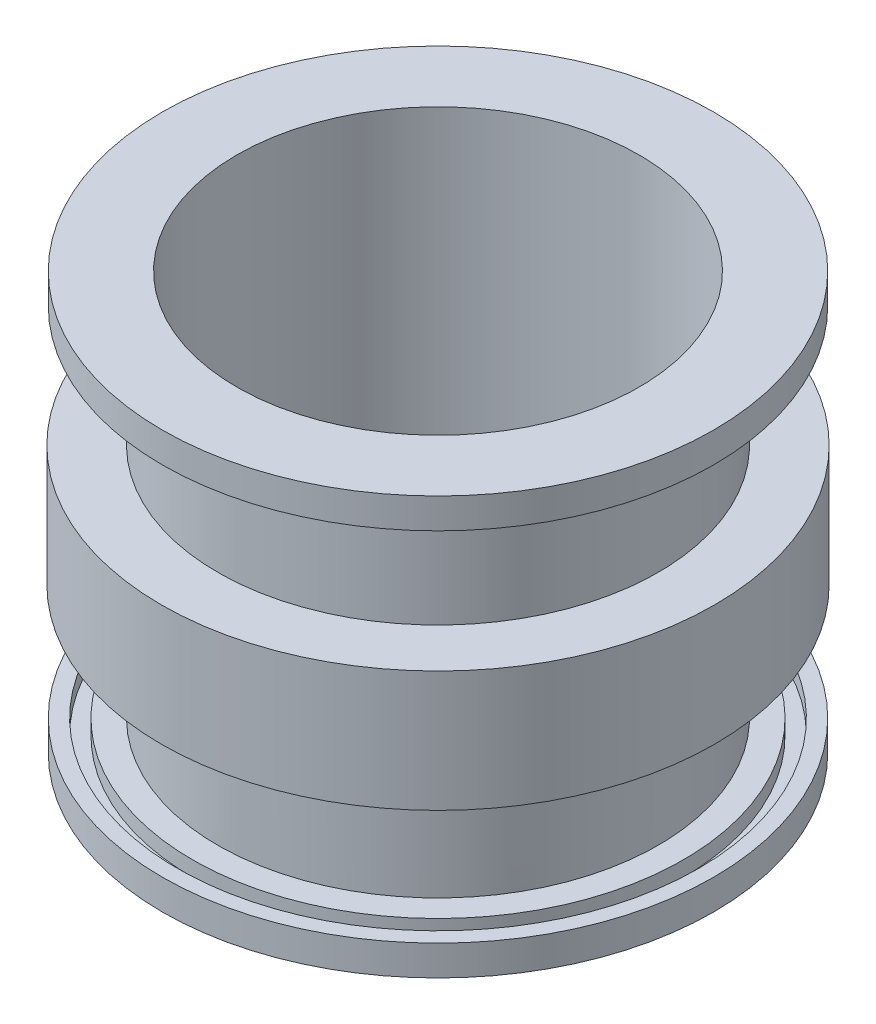
ISO-10303-21;
HEADER;
FILE_DESCRIPTION(('STEP AP214'),'2;1');
FILE_NAME('part.step','',(''),(''),'','','');
FILE_SCHEMA(('AUTOMOTIVE_DESIGN { 1 0 10303 214 1 1 1 1 }'));
ENDSEC;
DATA;
#1=APPLICATION_CONTEXT('core data for automotive mechanical design processes');
#2=APPLICATION_PROTOCOL_DEFINITION('international standard','automotive_design',2000,#1);
#3=PRODUCT_CONTEXT('',#1,'mechanical');
#4=PRODUCT('Part','Part','',(#3));
#5=PRODUCT_RELATED_PRODUCT_CATEGORY('part','',(#4));
#6=PRODUCT_DEFINITION_FORMATION('','',#4);
#7=PRODUCT_DEFINITION_CONTEXT('part definition',#1,'design');
#8=PRODUCT_DEFINITION('design','',#6,#7);
#9=PRODUCT_DEFINITION_SHAPE('','',#8);
#10=(LENGTH_UNIT() NAMED_UNIT(*) SI_UNIT(.MILLI.,.METRE.));
#11=(NAMED_UNIT(*) PLANE_ANGLE_UNIT() SI_UNIT($,.RADIAN.));
#12=(NAMED_UNIT(*) SI_UNIT($,.STERADIAN.) SOLID_ANGLE_UNIT());
#13=UNCERTAINTY_MEASURE_WITH_UNIT(LENGTH_MEASURE(1.E-05),#10,'distance_accuracy_value','');
#14=(GEOMETRIC_REPRESENTATION_CONTEXT(3) GLOBAL_UNCERTAINTY_ASSIGNED_CONTEXT((#13)) GLOBAL_UNIT_ASSIGNED_CONTEXT((#10,
#11,#12)) REPRESENTATION_CONTEXT('',''));
#15=CARTESIAN_POINT('',(0.,0.,0.));
#16=DIRECTION('',(0.,0.,1.));
#17=DIRECTION('',(1.,0.,0.));
#18=AXIS2_PLACEMENT_3D('',#15,#16,#17);
#19=CARTESIAN_POINT('',(0.,0.,0.));
#20=DIRECTION('',(0.,1.,0.));
#21=DIRECTION('',(1.,0.,0.));
#22=AXIS2_PLACEMENT_3D('',#19,#20,#21);
#23=PLANE('',#22);
#24=CARTESIAN_POINT('',(0.,0.,0.));
#25=DIRECTION('',(0.,-1.,0.));
#26=DIRECTION('',(1.,0.,0.));
#27=AXIS2_PLACEMENT_3D('',#24,#25,#26);
#28=CIRCLE('',#27,20.);
#29=CARTESIAN_POINT('',(-20.,0.,0.));
#30=VERTEX_POINT('',#29);
#31=EDGE_CURVE('E121',#30,#30,#28,.T.);
#32=ORIENTED_EDGE('',*,*,#31,.F.);
#33=EDGE_LOOP('',(#32));
#34=FACE_BOUND('',#33,.T.);
#35=CARTESIAN_POINT('',(0.,0.,0.));
#36=DIRECTION('',(0.,1.,0.));
#37=DIRECTION('',(1.,0.,0.));
#38=AXIS2_PLACEMENT_3D('',#35,#36,#37);
#39=CIRCLE('',#38,27.4);
#40=CARTESIAN_POINT('',(-27.4,0.,0.));
#41=VERTEX_POINT('',#40);
#42=EDGE_CURVE('E11',#41,#41,#39,.T.);
#43=ORIENTED_EDGE('',*,*,#42,.F.);
#44=EDGE_LOOP('',(#43));
#45=FACE_BOUND('',#44,.T.);
#46=ADVANCED_FACE('F17',(#34,#45),#23,.F.);
#47=CARTESIAN_POINT('',(0.,-2.075,0.));
#48=DIRECTION('',(0.,1.,0.));
#49=DIRECTION('',(1.,0.,0.));
#50=AXIS2_PLACEMENT_3D('',#47,#48,#49);
#51=CYLINDRICAL_SURFACE('',#50,27.4);
#52=CARTESIAN_POINT('',(0.,3.,0.));
#53=DIRECTION('',(0.,1.,0.));
#54=DIRECTION('',(1.,0.,0.));
#55=AXIS2_PLACEMENT_3D('',#52,#53,#54);
#56=CIRCLE('',#55,27.4);
#57=CARTESIAN_POINT('',(-27.4,3.,0.));
#58=VERTEX_POINT('',#57);
#59=EDGE_CURVE('E160',#58,#58,#56,.T.);
#60=ORIENTED_EDGE('',*,*,#59,.F.);
#61=DIRECTION('',(0.,-1.,0.));
#62=VECTOR('',#61,1.);
#63=CARTESIAN_POINT('',(-27.4,-2.075,0.));
#64=LINE('',#63,#62);
#65=EDGE_CURVE('E28',#58,#41,#64,.T.);
#66=ORIENTED_EDGE('',*,*,#65,.T.);
#67=ORIENTED_EDGE('',*,*,#42,.T.);
#68=ORIENTED_EDGE('',*,*,#65,.F.);
#69=EDGE_LOOP('',(#60,#66,#67,#68));
#70=FACE_BOUND('',#69,.T.);
#71=ADVANCED_FACE('F19',(#70),#51,.T.);
#72=CARTESIAN_POINT('',(0.,3.,0.));
#73=DIRECTION('',(0.,1.,0.));
#74=DIRECTION('',(1.,0.,0.));
#75=AXIS2_PLACEMENT_3D('',#72,#73,#74);
#76=PLANE('',#75);
#77=CARTESIAN_POINT('',(0.,3.,0.));
#78=DIRECTION('',(0.,1.,0.));
#79=DIRECTION('',(1.,0.,0.));
#80=AXIS2_PLACEMENT_3D('',#77,#78,#79);
#81=CIRCLE('',#80,25.9);
#82=CARTESIAN_POINT('',(-25.9,3.,0.));
#83=VERTEX_POINT('',#82);
#84=EDGE_CURVE('E166',#83,#83,#81,.T.);
#85=ORIENTED_EDGE('',*,*,#84,.F.);
#86=EDGE_LOOP('',(#85));
#87=FACE_BOUND('',#86,.T.);
#88=ORIENTED_EDGE('',*,*,#59,.T.);
#89=EDGE_LOOP('',(#88));
#90=FACE_BOUND('',#89,.T.);
#91=ADVANCED_FACE('F231',(#87,#90),#76,.T.);
#92=CARTESIAN_POINT('',(0.,-2.075,0.));
#93=DIRECTION('',(0.,1.,0.));
#94=DIRECTION('',(1.,0.,0.));
#95=AXIS2_PLACEMENT_3D('',#92,#93,#94);
#96=CYLINDRICAL_SURFACE('',#95,25.9);
#97=CARTESIAN_POINT('',(0.,1.5,0.));
#98=DIRECTION('',(0.,1.,0.));
#99=DIRECTION('',(1.,0.,0.));
#100=AXIS2_PLACEMENT_3D('',#97,#98,#99);
#101=CIRCLE('',#100,25.9);
#102=CARTESIAN_POINT('',(-25.9,1.5,0.));
#103=VERTEX_POINT('',#102);
#104=EDGE_CURVE('E142',#103,#103,#101,.T.);
#105=ORIENTED_EDGE('',*,*,#104,.F.);
#106=DIRECTION('',(0.,1.,0.));
#107=VECTOR('',#106,1.);
#108=CARTESIAN_POINT('',(-25.9,-2.075,0.));
#109=LINE('',#108,#107);
#110=EDGE_CURVE('E146',#103,#83,#109,.T.);
#111=ORIENTED_EDGE('',*,*,#110,.T.);
#112=ORIENTED_EDGE('',*,*,#84,.T.);
#113=ORIENTED_EDGE('',*,*,#110,.F.);
#114=EDGE_LOOP('',(#105,#111,#112,#113));
#115=FACE_BOUND('',#114,.T.);
#116=ADVANCED_FACE('F215',(#115),#96,.F.);
#117=CARTESIAN_POINT('',(0.,1.5,0.));
#118=DIRECTION('',(0.,1.,0.));
#119=DIRECTION('',(1.,0.,0.));
#120=AXIS2_PLACEMENT_3D('',#117,#118,#119);
#121=PLANE('',#120);
#122=CARTESIAN_POINT('',(0.,1.5,0.));
#123=DIRECTION('',(0.,1.,0.));
#124=DIRECTION('',(1.,0.,0.));
#125=AXIS2_PLACEMENT_3D('',#122,#123,#124);
#126=CIRCLE('',#125,24.4);
#127=CARTESIAN_POINT('',(-24.4,1.5,0.));
#128=VERTEX_POINT('',#127);
#129=EDGE_CURVE('E147',#128,#128,#126,.T.);
#130=ORIENTED_EDGE('',*,*,#129,.F.);
#131=EDGE_LOOP('',(#130));
#132=FACE_BOUND('',#131,.T.);
#133=ORIENTED_EDGE('',*,*,#104,.T.);
#134=EDGE_LOOP('',(#133));
#135=FACE_BOUND('',#134,.T.);
#136=ADVANCED_FACE('F218',(#132,#135),#121,.T.);
#137=CARTESIAN_POINT('',(0.,-2.075,0.));
#138=DIRECTION('',(0.,1.,0.));
#139=DIRECTION('',(1.,0.,0.));
#140=AXIS2_PLACEMENT_3D('',#137,#138,#139);
#141=CYLINDRICAL_SURFACE('',#140,24.4);
#142=CARTESIAN_POINT('',(0.,3.,0.));
#143=DIRECTION('',(0.,1.,0.));
#144=DIRECTION('',(1.,0.,0.));
#145=AXIS2_PLACEMENT_3D('',#142,#143,#144);
#146=CIRCLE('',#145,24.4);
#147=CARTESIAN_POINT('',(-24.4,3.,0.));
#148=VERTEX_POINT('',#147);
#149=EDGE_CURVE('E200',#148,#148,#146,.T.);
#150=ORIENTED_EDGE('',*,*,#149,.F.);
#151=DIRECTION('',(0.,-1.,0.));
#152=VECTOR('',#151,1.);
#153=CARTESIAN_POINT('',(-24.4,-2.075,0.));
#154=LINE('',#153,#152);
#155=EDGE_CURVE('E21',#148,#128,#154,.T.);
#156=ORIENTED_EDGE('',*,*,#155,.T.);
#157=ORIENTED_EDGE('',*,*,#129,.T.);
#158=ORIENTED_EDGE('',*,*,#155,.F.);
#159=EDGE_LOOP('',(#150,#156,#157,#158));
#160=FACE_BOUND('',#159,.T.);
#161=ADVANCED_FACE('F220',(#160),#141,.T.);
#162=CARTESIAN_POINT('',(0.,3.,0.));
#163=DIRECTION('',(0.,1.,0.));
#164=DIRECTION('',(1.,0.,0.));
#165=AXIS2_PLACEMENT_3D('',#162,#163,#164);
#166=PLANE('',#165);
#167=CARTESIAN_POINT('',(0.,2.999999999999,0.));
#168=DIRECTION('',(0.,1.,0.));
#169=DIRECTION('',(1.,0.,0.));
#170=AXIS2_PLACEMENT_3D('',#167,#168,#169);
#171=CIRCLE('',#170,21.9);
#172=CARTESIAN_POINT('',(-21.9,3.,0.));
#173=VERTEX_POINT('',#172);
#174=EDGE_CURVE('E171',#173,#173,#171,.T.);
#175=ORIENTED_EDGE('',*,*,#174,.F.);
#176=EDGE_LOOP('',(#175));
#177=FACE_BOUND('',#176,.T.);
#178=ORIENTED_EDGE('',*,*,#149,.T.);
#179=EDGE_LOOP('',(#178));
#180=FACE_BOUND('',#179,.T.);
#181=ADVANCED_FACE('F228',(#177,#180),#166,.T.);
#182=CARTESIAN_POINT('',(0.,8.75,0.));
#183=DIRECTION('',(0.,1.,0.));
#184=DIRECTION('',(1.,0.,0.));
#185=AXIS2_PLACEMENT_3D('',#182,#183,#184);
#186=CONICAL_SURFACE('',#185,21.95,0.00869543301179552);
#187=CARTESIAN_POINT('',(0.,14.5,0.));
#188=DIRECTION('',(0.,1.,0.));
#189=DIRECTION('',(1.,0.,0.));
#190=AXIS2_PLACEMENT_3D('',#187,#188,#189);
#191=CIRCLE('',#190,22.);
#192=CARTESIAN_POINT('',(-22.,14.5,0.));
#193=VERTEX_POINT('',#192);
#194=EDGE_CURVE('E148',#193,#193,#191,.T.);
#195=ORIENTED_EDGE('',*,*,#194,.F.);
#196=DIRECTION('',(0.00869532343445127,-0.999962194960575,0.));
#197=VECTOR('',#196,1.);
#198=CARTESIAN_POINT('',(-21.95,8.75,0.));
#199=LINE('',#198,#197);
#200=EDGE_CURVE('E152',#193,#173,#199,.T.);
#201=ORIENTED_EDGE('',*,*,#200,.T.);
#202=ORIENTED_EDGE('',*,*,#174,.T.);
#203=ORIENTED_EDGE('',*,*,#200,.F.);
#204=EDGE_LOOP('',(#195,#201,#202,#203));
#205=FACE_BOUND('',#204,.T.);
#206=ADVANCED_FACE('F268',(#205),#186,.T.);
#207=CARTESIAN_POINT('',(0.,14.5,0.));
#208=DIRECTION('',(0.,1.,0.));
#209=DIRECTION('',(1.,0.,0.));
#210=AXIS2_PLACEMENT_3D('',#207,#208,#209);
#211=PLANE('',#210);
#212=ORIENTED_EDGE('',*,*,#194,.T.);
#213=EDGE_LOOP('',(#212));
#214=FACE_BOUND('',#213,.T.);
#215=CARTESIAN_POINT('',(0.,14.5,0.));
#216=DIRECTION('',(0.,1.,0.));
#217=DIRECTION('',(1.,0.,0.));
#218=AXIS2_PLACEMENT_3D('',#215,#216,#217);
#219=CIRCLE('',#218,27.5);
#220=CARTESIAN_POINT('',(-27.5,14.5,0.));
#221=VERTEX_POINT('',#220);
#222=EDGE_CURVE('E153',#221,#221,#219,.T.);
#223=ORIENTED_EDGE('',*,*,#222,.F.);
#224=EDGE_LOOP('',(#223));
#225=FACE_BOUND('',#224,.T.);
#226=ADVANCED_FACE('F271',(#214,#225),#211,.F.);
#227=CARTESIAN_POINT('',(0.,-2.075,0.));
#228=DIRECTION('',(0.,1.,0.));
#229=DIRECTION('',(1.,0.,0.));
#230=AXIS2_PLACEMENT_3D('',#227,#228,#229);
#231=CYLINDRICAL_SURFACE('',#230,27.5);
#232=CARTESIAN_POINT('',(0.,26.5,0.));
#233=DIRECTION('',(0.,1.,0.));
#234=DIRECTION('',(1.,0.,0.));
#235=AXIS2_PLACEMENT_3D('',#232,#233,#234);
#236=CIRCLE('',#235,27.5);
#237=CARTESIAN_POINT('',(-27.5,26.5,0.));
#238=VERTEX_POINT('',#237);
#239=EDGE_CURVE('E141',#238,#238,#236,.T.);
#240=ORIENTED_EDGE('',*,*,#239,.F.);
#241=DIRECTION('',(0.,-1.,0.));
#242=VECTOR('',#241,1.);
#243=CARTESIAN_POINT('',(-27.5,-2.075,0.));
#244=LINE('',#243,#242);
#245=EDGE_CURVE('E208',#238,#221,#244,.T.);
#246=ORIENTED_EDGE('',*,*,#245,.T.);
#247=ORIENTED_EDGE('',*,*,#222,.T.);
#248=ORIENTED_EDGE('',*,*,#245,.F.);
#249=EDGE_LOOP('',(#240,#246,#247,#248));
#250=FACE_BOUND('',#249,.T.);
#251=ADVANCED_FACE('F244',(#250),#231,.T.);
#252=CARTESIAN_POINT('',(0.,26.5,0.));
#253=DIRECTION('',(0.,1.,0.));
#254=DIRECTION('',(1.,0.,0.));
#255=AXIS2_PLACEMENT_3D('',#252,#253,#254);
#256=PLANE('',#255);
#257=CARTESIAN_POINT('',(0.,26.5,0.));
#258=DIRECTION('',(0.,1.,0.));
#259=DIRECTION('',(1.,0.,0.));
#260=AXIS2_PLACEMENT_3D('',#257,#258,#259);
#261=CIRCLE('',#260,21.9);
#262=CARTESIAN_POINT('',(-21.9,26.5,0.));
#263=VERTEX_POINT('',#262);
#264=EDGE_CURVE('E138',#263,#263,#261,.T.);
#265=ORIENTED_EDGE('',*,*,#264,.F.);
#266=EDGE_LOOP('',(#265));
#267=FACE_BOUND('',#266,.T.);
#268=ORIENTED_EDGE('',*,*,#239,.T.);
#269=EDGE_LOOP('',(#268));
#270=FACE_BOUND('',#269,.T.);
#271=ADVANCED_FACE('F254',(#267,#270),#256,.T.);
#272=CARTESIAN_POINT('',(0.,-2.075,0.));
#273=DIRECTION('',(0.,1.,0.));
#274=DIRECTION('',(1.,0.,0.));
#275=AXIS2_PLACEMENT_3D('',#272,#273,#274);
#276=CYLINDRICAL_SURFACE('',#275,21.9);
#277=CARTESIAN_POINT('',(0.,38.5,0.));
#278=DIRECTION('',(0.,1.,0.));
#279=DIRECTION('',(1.,0.,0.));
#280=AXIS2_PLACEMENT_3D('',#277,#278,#279);
#281=CIRCLE('',#280,21.9);
#282=CARTESIAN_POINT('',(-21.9,38.5,0.));
#283=VERTEX_POINT('',#282);
#284=EDGE_CURVE('E164',#283,#283,#281,.T.);
#285=ORIENTED_EDGE('',*,*,#284,.F.);
#286=DIRECTION('',(0.,-1.,0.));
#287=VECTOR('',#286,1.);
#288=CARTESIAN_POINT('',(-21.9,-2.075,0.));
#289=LINE('',#288,#287);
#290=EDGE_CURVE('E101',#283,#263,#289,.T.);
#291=ORIENTED_EDGE('',*,*,#290,.T.);
#292=ORIENTED_EDGE('',*,*,#264,.T.);
#293=ORIENTED_EDGE('',*,*,#290,.F.);
#294=EDGE_LOOP('',(#285,#291,#292,#293));
#295=FACE_BOUND('',#294,.T.);
#296=ADVANCED_FACE('F257',(#295),#276,.T.);
#297=CARTESIAN_POINT('',(0.,38.5,0.));
#298=DIRECTION('',(0.,1.,0.));
#299=DIRECTION('',(1.,0.,0.));
#300=AXIS2_PLACEMENT_3D('',#297,#298,#299);
#301=PLANE('',#300);
#302=ORIENTED_EDGE('',*,*,#284,.T.);
#303=EDGE_LOOP('',(#302));
#304=FACE_BOUND('',#303,.T.);
#305=CARTESIAN_POINT('',(0.,38.5,0.));
#306=DIRECTION('',(0.,1.,0.));
#307=DIRECTION('',(1.,0.,0.));
#308=AXIS2_PLACEMENT_3D('',#305,#306,#307);
#309=CIRCLE('',#308,24.4);
#310=CARTESIAN_POINT('',(-24.4,38.5,0.));
#311=VERTEX_POINT('',#310);
#312=EDGE_CURVE('E111',#311,#311,#309,.T.);
#313=ORIENTED_EDGE('',*,*,#312,.F.);
#314=EDGE_LOOP('',(#313));
#315=FACE_BOUND('',#314,.T.);
#316=ADVANCED_FACE('F275',(#304,#315),#301,.F.);
#317=CARTESIAN_POINT('',(0.,-2.075,0.));
#318=DIRECTION('',(0.,1.,0.));
#319=DIRECTION('',(1.,0.,0.));
#320=AXIS2_PLACEMENT_3D('',#317,#318,#319);
#321=CYLINDRICAL_SURFACE('',#320,24.4);
#322=CARTESIAN_POINT('',(0.,40.,0.));
#323=DIRECTION('',(0.,1.,0.));
#324=DIRECTION('',(1.,0.,0.));
#325=AXIS2_PLACEMENT_3D('',#322,#323,#324);
#326=CIRCLE('',#325,24.4);
#327=CARTESIAN_POINT('',(-24.4,40.,0.));
#328=VERTEX_POINT('',#327);
#329=EDGE_CURVE('E136',#328,#328,#326,.T.);
#330=ORIENTED_EDGE('',*,*,#329,.F.);
#331=DIRECTION('',(0.,-1.,0.));
#332=VECTOR('',#331,1.);
#333=CARTESIAN_POINT('',(-24.4,-2.075,0.));
#334=LINE('',#333,#332);
#335=EDGE_CURVE('E165',#328,#311,#334,.T.);
#336=ORIENTED_EDGE('',*,*,#335,.T.);
#337=ORIENTED_EDGE('',*,*,#312,.T.);
#338=ORIENTED_EDGE('',*,*,#335,.F.);
#339=EDGE_LOOP('',(#330,#336,#337,#338));
#340=FACE_BOUND('',#339,.T.);
#341=ADVANCED_FACE('F249',(#340),#321,.T.);
#342=CARTESIAN_POINT('',(0.,40.,0.));
#343=DIRECTION('',(0.,1.,0.));
#344=DIRECTION('',(1.,0.,0.));
#345=AXIS2_PLACEMENT_3D('',#342,#343,#344);
#346=PLANE('',#345);
#347=ORIENTED_EDGE('',*,*,#329,.T.);
#348=EDGE_LOOP('',(#347));
#349=FACE_BOUND('',#348,.T.);
#350=CARTESIAN_POINT('',(0.,40.,0.));
#351=DIRECTION('',(0.,1.,0.));
#352=DIRECTION('',(1.,0.,0.));
#353=AXIS2_PLACEMENT_3D('',#350,#351,#352);
#354=CIRCLE('',#353,25.9);
#355=CARTESIAN_POINT('',(-25.9,40.,0.));
#356=VERTEX_POINT('',#355);
#357=EDGE_CURVE('E204',#356,#356,#354,.T.);
#358=ORIENTED_EDGE('',*,*,#357,.F.);
#359=EDGE_LOOP('',(#358));
#360=FACE_BOUND('',#359,.T.);
#361=ADVANCED_FACE('F245',(#349,#360),#346,.F.);
#362=CARTESIAN_POINT('',(0.,-2.075,0.));
#363=DIRECTION('',(0.,1.,0.));
#364=DIRECTION('',(1.,0.,0.));
#365=AXIS2_PLACEMENT_3D('',#362,#363,#364);
#366=CYLINDRICAL_SURFACE('',#365,25.9);
#367=CARTESIAN_POINT('',(0.,38.5,0.));
#368=DIRECTION('',(0.,1.,0.));
#369=DIRECTION('',(1.,0.,0.));
#370=AXIS2_PLACEMENT_3D('',#367,#368,#369);
#371=CIRCLE('',#370,25.9);
#372=CARTESIAN_POINT('',(-25.9,38.5,0.));
#373=VERTEX_POINT('',#372);
#374=EDGE_CURVE('E187',#373,#373,#371,.T.);
#375=ORIENTED_EDGE('',*,*,#374,.F.);
#376=DIRECTION('',(0.,1.,0.));
#377=VECTOR('',#376,1.);
#378=CARTESIAN_POINT('',(-25.9,-2.075,0.));
#379=LINE('',#378,#377);
#380=EDGE_CURVE('E193',#373,#356,#379,.T.);
#381=ORIENTED_EDGE('',*,*,#380,.T.);
#382=ORIENTED_EDGE('',*,*,#357,.T.);
#383=ORIENTED_EDGE('',*,*,#380,.F.);
#384=EDGE_LOOP('',(#375,#381,#382,#383));
#385=FACE_BOUND('',#384,.T.);
#386=ADVANCED_FACE('F248',(#385),#366,.F.);
#387=CARTESIAN_POINT('',(0.,38.5,0.));
#388=DIRECTION('',(0.,1.,0.));
#389=DIRECTION('',(1.,0.,0.));
#390=AXIS2_PLACEMENT_3D('',#387,#388,#389);
#391=PLANE('',#390);
#392=ORIENTED_EDGE('',*,*,#374,.T.);
#393=EDGE_LOOP('',(#392));
#394=FACE_BOUND('',#393,.T.);
#395=CARTESIAN_POINT('',(0.,38.5,0.));
#396=DIRECTION('',(0.,1.,0.));
#397=DIRECTION('',(1.,0.,0.));
#398=AXIS2_PLACEMENT_3D('',#395,#396,#397);
#399=CIRCLE('',#398,27.4);
#400=CARTESIAN_POINT('',(-27.4,38.5,0.));
#401=VERTEX_POINT('',#400);
#402=EDGE_CURVE('E158',#401,#401,#399,.T.);
#403=ORIENTED_EDGE('',*,*,#402,.F.);
#404=EDGE_LOOP('',(#403));
#405=FACE_BOUND('',#404,.T.);
#406=ADVANCED_FACE('F261',(#394,#405),#391,.F.);
#407=CARTESIAN_POINT('',(0.,-2.075,0.));
#408=DIRECTION('',(0.,1.,0.));
#409=DIRECTION('',(1.,0.,0.));
#410=AXIS2_PLACEMENT_3D('',#407,#408,#409);
#411=CYLINDRICAL_SURFACE('',#410,27.4);
#412=CARTESIAN_POINT('',(0.,41.5,0.));
#413=DIRECTION('',(0.,1.,0.));
#414=DIRECTION('',(1.,0.,0.));
#415=AXIS2_PLACEMENT_3D('',#412,#413,#414);
#416=CIRCLE('',#415,27.4);
#417=CARTESIAN_POINT('',(-27.4,41.5,0.));
#418=VERTEX_POINT('',#417);
#419=EDGE_CURVE('E131',#418,#418,#416,.T.);
#420=ORIENTED_EDGE('',*,*,#419,.F.);
#421=DIRECTION('',(0.,-1.,0.));
#422=VECTOR('',#421,1.);
#423=CARTESIAN_POINT('',(-27.4,-2.075,0.));
#424=LINE('',#423,#422);
#425=EDGE_CURVE('E154',#418,#401,#424,.T.);
#426=ORIENTED_EDGE('',*,*,#425,.T.);
#427=ORIENTED_EDGE('',*,*,#402,.T.);
#428=ORIENTED_EDGE('',*,*,#425,.F.);
#429=EDGE_LOOP('',(#420,#426,#427,#428));
#430=FACE_BOUND('',#429,.T.);
#431=ADVANCED_FACE('F180',(#430),#411,.T.);
#432=CARTESIAN_POINT('',(0.,41.5,0.));
#433=DIRECTION('',(0.,1.,0.));
#434=DIRECTION('',(1.,0.,0.));
#435=AXIS2_PLACEMENT_3D('',#432,#433,#434);
#436=PLANE('',#435);
#437=CARTESIAN_POINT('',(0.,41.5,0.));
#438=DIRECTION('',(0.,1.,0.));
#439=DIRECTION('',(1.,0.,0.));
#440=AXIS2_PLACEMENT_3D('',#437,#438,#439);
#441=CIRCLE('',#440,20.);
#442=CARTESIAN_POINT('',(-20.,41.5,0.));
#443=VERTEX_POINT('',#442);
#444=EDGE_CURVE('E123',#443,#443,#441,.T.);
#445=ORIENTED_EDGE('',*,*,#444,.F.);
#446=EDGE_LOOP('',(#445));
#447=FACE_BOUND('',#446,.T.);
#448=ORIENTED_EDGE('',*,*,#419,.T.);
#449=EDGE_LOOP('',(#448));
#450=FACE_BOUND('',#449,.T.);
#451=ADVANCED_FACE('F178',(#447,#450),#436,.T.);
#452=CARTESIAN_POINT('',(0.,-2.075,0.));
#453=DIRECTION('',(0.,1.,0.));
#454=DIRECTION('',(1.,0.,0.));
#455=AXIS2_PLACEMENT_3D('',#452,#453,#454);
#456=CYLINDRICAL_SURFACE('',#455,20.);
#457=ORIENTED_EDGE('',*,*,#31,.T.);
#458=DIRECTION('',(0.,1.,0.));
#459=VECTOR('',#458,1.);
#460=CARTESIAN_POINT('',(-20.,-2.075,0.));
#461=LINE('',#460,#459);
#462=EDGE_CURVE('E118',#30,#443,#461,.T.);
#463=ORIENTED_EDGE('',*,*,#462,.T.);
#464=ORIENTED_EDGE('',*,*,#444,.T.);
#465=ORIENTED_EDGE('',*,*,#462,.F.);
#466=EDGE_LOOP('',(#457,#463,#464,#465));
#467=FACE_BOUND('',#466,.T.);
#468=ADVANCED_FACE('F119',(#467),#456,.F.);
#469=CLOSED_SHELL('',(#46,#71,#91,#116,#136,#161,#181,#206,#226,#251,#271,#296,#316,#341,#361,
#386,#406,#431,#451,#468));
#470=MANIFOLD_SOLID_BREP('B1',#469);
#471=ADVANCED_BREP_SHAPE_REPRESENTATION('',(#18,#470),#14);
#472=SHAPE_DEFINITION_REPRESENTATION(#9,#471);
ENDSEC;
END-ISO-10303-21;
